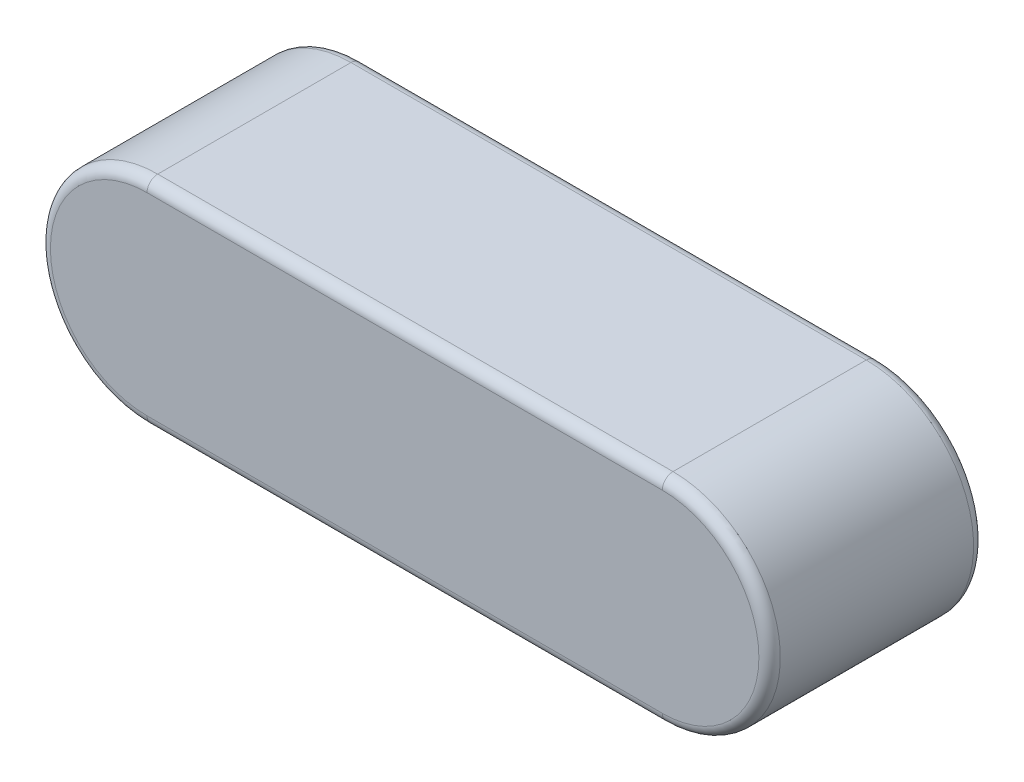
ISO-10303-21;
HEADER;
FILE_DESCRIPTION(('STEP AP214'),'2;1');
FILE_NAME('part.step','',(''),(''),'','','');
FILE_SCHEMA(('AUTOMOTIVE_DESIGN { 1 0 10303 214 1 1 1 1 }'));
ENDSEC;
DATA;
#1=APPLICATION_CONTEXT('core data for automotive mechanical design processes');
#2=APPLICATION_PROTOCOL_DEFINITION('international standard','automotive_design',2000,#1);
#3=PRODUCT_CONTEXT('',#1,'mechanical');
#4=PRODUCT('Part','Part','',(#3));
#5=PRODUCT_RELATED_PRODUCT_CATEGORY('part','',(#4));
#6=PRODUCT_DEFINITION_FORMATION('','',#4);
#7=PRODUCT_DEFINITION_CONTEXT('part definition',#1,'design');
#8=PRODUCT_DEFINITION('design','',#6,#7);
#9=PRODUCT_DEFINITION_SHAPE('','',#8);
#10=(LENGTH_UNIT() NAMED_UNIT(*) SI_UNIT(.MILLI.,.METRE.));
#11=(NAMED_UNIT(*) PLANE_ANGLE_UNIT() SI_UNIT($,.RADIAN.));
#12=(NAMED_UNIT(*) SI_UNIT($,.STERADIAN.) SOLID_ANGLE_UNIT());
#13=UNCERTAINTY_MEASURE_WITH_UNIT(LENGTH_MEASURE(1.E-05),#10,'distance_accuracy_value','');
#14=(GEOMETRIC_REPRESENTATION_CONTEXT(3) GLOBAL_UNCERTAINTY_ASSIGNED_CONTEXT((#13)) GLOBAL_UNIT_ASSIGNED_CONTEXT((#10,
#11,#12)) REPRESENTATION_CONTEXT('',''));
#15=CARTESIAN_POINT('',(0.,0.,0.));
#16=DIRECTION('',(0.,0.,1.));
#17=DIRECTION('',(1.,0.,0.));
#18=AXIS2_PLACEMENT_3D('',#15,#16,#17);
#19=CARTESIAN_POINT('',(-6.,0.,5.));
#20=DIRECTION('',(0.,0.,-1.));
#21=DIRECTION('',(-1.,0.,0.));
#22=AXIS2_PLACEMENT_3D('',#19,#20,#21);
#23=CYLINDRICAL_SURFACE('',#22,2.5);
#24=DIRECTION('',(0.,0.,-1.));
#25=VECTOR('',#24,1.);
#26=CARTESIAN_POINT('',(-6.,-2.5,5.));
#27=LINE('',#26,#25);
#28=CARTESIAN_POINT('',(-6.,-2.5,4.75));
#29=VERTEX_POINT('',#28);
#30=CARTESIAN_POINT('',(-6.,-2.5,0.25));
#31=VERTEX_POINT('',#30);
#32=EDGE_CURVE('E123',#29,#31,#27,.T.);
#33=ORIENTED_EDGE('',*,*,#32,.F.);
#34=CARTESIAN_POINT('',(-6.,0.,4.75));
#35=DIRECTION('',(0.,0.,1.));
#36=DIRECTION('',(1.,0.,0.));
#37=AXIS2_PLACEMENT_3D('',#34,#35,#36);
#38=CIRCLE('',#37,2.5);
#39=CARTESIAN_POINT('',(-6.,2.5,4.75));
#40=VERTEX_POINT('',#39);
#41=EDGE_CURVE('E59',#29,#40,#38,.F.);
#42=ORIENTED_EDGE('',*,*,#41,.T.);
#43=DIRECTION('',(0.,0.,-1.));
#44=VECTOR('',#43,1.);
#45=CARTESIAN_POINT('',(-6.,2.5,5.));
#46=LINE('',#45,#44);
#47=CARTESIAN_POINT('',(-6.,2.5,0.25));
#48=VERTEX_POINT('',#47);
#49=EDGE_CURVE('E159',#40,#48,#46,.T.);
#50=ORIENTED_EDGE('',*,*,#49,.T.);
#51=CARTESIAN_POINT('',(-6.,0.,0.25));
#52=DIRECTION('',(0.,0.,1.));
#53=DIRECTION('',(1.,0.,0.));
#54=AXIS2_PLACEMENT_3D('',#51,#52,#53);
#55=CIRCLE('',#54,2.5);
#56=EDGE_CURVE('E150',#48,#31,#55,.T.);
#57=ORIENTED_EDGE('',*,*,#56,.T.);
#58=EDGE_LOOP('',(#33,#42,#50,#57));
#59=FACE_BOUND('',#58,.T.);
#60=ADVANCED_FACE('F36',(#59),#23,.T.);
#61=CARTESIAN_POINT('',(-6.,-2.5,5.));
#62=DIRECTION('',(0.,1.,0.));
#63=DIRECTION('',(-1.,0.,0.));
#64=AXIS2_PLACEMENT_3D('',#61,#62,#63);
#65=PLANE('',#64);
#66=DIRECTION('',(0.,0.,-1.));
#67=VECTOR('',#66,1.);
#68=CARTESIAN_POINT('',(6.,-2.49999999999999,5.));
#69=LINE('',#68,#67);
#70=CARTESIAN_POINT('',(6.,-2.49999999999999,4.75));
#71=VERTEX_POINT('',#70);
#72=CARTESIAN_POINT('',(6.,-2.49999999999999,0.25));
#73=VERTEX_POINT('',#72);
#74=EDGE_CURVE('E192',#71,#73,#69,.T.);
#75=ORIENTED_EDGE('',*,*,#74,.F.);
#76=DIRECTION('',(1.,0.,0.));
#77=VECTOR('',#76,1.);
#78=CARTESIAN_POINT('',(-6.,-2.5,4.75));
#79=LINE('',#78,#77);
#80=EDGE_CURVE('E148',#71,#29,#79,.F.);
#81=ORIENTED_EDGE('',*,*,#80,.T.);
#82=ORIENTED_EDGE('',*,*,#32,.T.);
#83=DIRECTION('',(1.,0.,0.));
#84=VECTOR('',#83,1.);
#85=CARTESIAN_POINT('',(-6.,-2.5,0.25));
#86=LINE('',#85,#84);
#87=EDGE_CURVE('E146',#31,#73,#86,.T.);
#88=ORIENTED_EDGE('',*,*,#87,.T.);
#89=EDGE_LOOP('',(#75,#81,#82,#88));
#90=FACE_BOUND('',#89,.T.);
#91=ADVANCED_FACE('F206',(#90),#65,.F.);
#92=CARTESIAN_POINT('',(6.,0.,5.));
#93=DIRECTION('',(0.,0.,-1.));
#94=DIRECTION('',(-1.,0.,0.));
#95=AXIS2_PLACEMENT_3D('',#92,#93,#94);
#96=CYLINDRICAL_SURFACE('',#95,2.5);
#97=DIRECTION('',(0.,0.,-1.));
#98=VECTOR('',#97,1.);
#99=CARTESIAN_POINT('',(6.,2.5,5.));
#100=LINE('',#99,#98);
#101=CARTESIAN_POINT('',(6.,2.5,4.75));
#102=VERTEX_POINT('',#101);
#103=CARTESIAN_POINT('',(6.,2.5,0.25));
#104=VERTEX_POINT('',#103);
#105=EDGE_CURVE('E190',#102,#104,#100,.T.);
#106=ORIENTED_EDGE('',*,*,#105,.F.);
#107=CARTESIAN_POINT('',(6.,0.,4.75));
#108=DIRECTION('',(0.,0.,1.));
#109=DIRECTION('',(1.,0.,0.));
#110=AXIS2_PLACEMENT_3D('',#107,#108,#109);
#111=CIRCLE('',#110,2.5);
#112=EDGE_CURVE('E110',#102,#71,#111,.F.);
#113=ORIENTED_EDGE('',*,*,#112,.T.);
#114=ORIENTED_EDGE('',*,*,#74,.T.);
#115=CARTESIAN_POINT('',(6.,0.,0.25));
#116=DIRECTION('',(0.,0.,1.));
#117=DIRECTION('',(1.,0.,0.));
#118=AXIS2_PLACEMENT_3D('',#115,#116,#117);
#119=CIRCLE('',#118,2.5);
#120=EDGE_CURVE('E129',#73,#104,#119,.T.);
#121=ORIENTED_EDGE('',*,*,#120,.T.);
#122=EDGE_LOOP('',(#106,#113,#114,#121));
#123=FACE_BOUND('',#122,.T.);
#124=ADVANCED_FACE('F189',(#123),#96,.T.);
#125=CARTESIAN_POINT('',(-6.,2.5,5.));
#126=DIRECTION('',(0.,-1.,0.));
#127=DIRECTION('',(1.,0.,0.));
#128=AXIS2_PLACEMENT_3D('',#125,#126,#127);
#129=PLANE('',#128);
#130=ORIENTED_EDGE('',*,*,#49,.F.);
#131=DIRECTION('',(-1.,0.,0.));
#132=VECTOR('',#131,1.);
#133=CARTESIAN_POINT('',(6.,2.5,4.75));
#134=LINE('',#133,#132);
#135=EDGE_CURVE('E11',#40,#102,#134,.F.);
#136=ORIENTED_EDGE('',*,*,#135,.T.);
#137=ORIENTED_EDGE('',*,*,#105,.T.);
#138=DIRECTION('',(-1.,0.,0.));
#139=VECTOR('',#138,1.);
#140=CARTESIAN_POINT('',(-6.,2.5,0.25));
#141=LINE('',#140,#139);
#142=EDGE_CURVE('E45',#104,#48,#141,.T.);
#143=ORIENTED_EDGE('',*,*,#142,.T.);
#144=EDGE_LOOP('',(#130,#136,#137,#143));
#145=FACE_BOUND('',#144,.T.);
#146=ADVANCED_FACE('F193',(#145),#129,.F.);
#147=CARTESIAN_POINT('',(-6.,0.,5.));
#148=DIRECTION('',(0.,0.,1.));
#149=DIRECTION('',(1.,0.,0.));
#150=AXIS2_PLACEMENT_3D('',#147,#148,#149);
#151=PLANE('',#150);
#152=DIRECTION('',(1.,0.,0.));
#153=VECTOR('',#152,1.);
#154=CARTESIAN_POINT('',(6.,-2.25,5.));
#155=LINE('',#154,#153);
#156=CARTESIAN_POINT('',(-6.,-2.25,5.));
#157=VERTEX_POINT('',#156);
#158=CARTESIAN_POINT('',(6.,-2.25,5.));
#159=VERTEX_POINT('',#158);
#160=EDGE_CURVE('E127',#157,#159,#155,.T.);
#161=ORIENTED_EDGE('',*,*,#160,.T.);
#162=CARTESIAN_POINT('',(6.,0.,5.));
#163=DIRECTION('',(0.,0.,1.));
#164=DIRECTION('',(1.,0.,0.));
#165=AXIS2_PLACEMENT_3D('',#162,#163,#164);
#166=CIRCLE('',#165,2.25);
#167=CARTESIAN_POINT('',(6.,2.25,5.));
#168=VERTEX_POINT('',#167);
#169=EDGE_CURVE('E108',#159,#168,#166,.T.);
#170=ORIENTED_EDGE('',*,*,#169,.T.);
#171=DIRECTION('',(-1.,0.,0.));
#172=VECTOR('',#171,1.);
#173=CARTESIAN_POINT('',(-6.,2.25,5.));
#174=LINE('',#173,#172);
#175=CARTESIAN_POINT('',(-6.,2.25,5.));
#176=VERTEX_POINT('',#175);
#177=EDGE_CURVE('E116',#168,#176,#174,.T.);
#178=ORIENTED_EDGE('',*,*,#177,.T.);
#179=CARTESIAN_POINT('',(-6.,0.,5.));
#180=DIRECTION('',(0.,0.,1.));
#181=DIRECTION('',(1.,0.,0.));
#182=AXIS2_PLACEMENT_3D('',#179,#180,#181);
#183=CIRCLE('',#182,2.25);
#184=EDGE_CURVE('E122',#176,#157,#183,.T.);
#185=ORIENTED_EDGE('',*,*,#184,.T.);
#186=EDGE_LOOP('',(#161,#170,#178,#185));
#187=FACE_BOUND('',#186,.T.);
#188=ADVANCED_FACE('F125',(#187),#151,.T.);
#189=CARTESIAN_POINT('',(-6.,0.,0.));
#190=DIRECTION('',(0.,0.,1.));
#191=DIRECTION('',(1.,0.,0.));
#192=AXIS2_PLACEMENT_3D('',#189,#190,#191);
#193=PLANE('',#192);
#194=DIRECTION('',(-1.,0.,0.));
#195=VECTOR('',#194,1.);
#196=CARTESIAN_POINT('',(-6.,2.25,0.));
#197=LINE('',#196,#195);
#198=CARTESIAN_POINT('',(-6.,2.25,0.));
#199=VERTEX_POINT('',#198);
#200=CARTESIAN_POINT('',(6.,2.25,0.));
#201=VERTEX_POINT('',#200);
#202=EDGE_CURVE('E141',#199,#201,#197,.F.);
#203=ORIENTED_EDGE('',*,*,#202,.T.);
#204=CARTESIAN_POINT('',(6.,0.,0.));
#205=DIRECTION('',(0.,0.,1.));
#206=DIRECTION('',(1.,0.,0.));
#207=AXIS2_PLACEMENT_3D('',#204,#205,#206);
#208=CIRCLE('',#207,2.25);
#209=CARTESIAN_POINT('',(6.,-2.25,0.));
#210=VERTEX_POINT('',#209);
#211=EDGE_CURVE('E143',#201,#210,#208,.F.);
#212=ORIENTED_EDGE('',*,*,#211,.T.);
#213=DIRECTION('',(1.,0.,0.));
#214=VECTOR('',#213,1.);
#215=CARTESIAN_POINT('',(-6.,-2.25,0.));
#216=LINE('',#215,#214);
#217=CARTESIAN_POINT('',(-6.,-2.25,0.));
#218=VERTEX_POINT('',#217);
#219=EDGE_CURVE('E137',#210,#218,#216,.F.);
#220=ORIENTED_EDGE('',*,*,#219,.T.);
#221=CARTESIAN_POINT('',(-6.,0.,0.));
#222=DIRECTION('',(0.,0.,1.));
#223=DIRECTION('',(1.,0.,0.));
#224=AXIS2_PLACEMENT_3D('',#221,#222,#223);
#225=CIRCLE('',#224,2.25);
#226=EDGE_CURVE('E139',#218,#199,#225,.F.);
#227=ORIENTED_EDGE('',*,*,#226,.T.);
#228=EDGE_LOOP('',(#203,#212,#220,#227));
#229=FACE_BOUND('',#228,.T.);
#230=ADVANCED_FACE('F179',(#229),#193,.F.);
#231=CARTESIAN_POINT('',(-6.,0.,4.75));
#232=DIRECTION('',(0.,0.,1.));
#233=DIRECTION('',(1.,0.,0.));
#234=AXIS2_PLACEMENT_3D('',#231,#232,#233);
#235=TOROIDAL_SURFACE('',#234,2.25,0.25);
#236=CARTESIAN_POINT('',(-6.,2.25,4.75));
#237=DIRECTION('',(1.,0.,0.));
#238=DIRECTION('',(0.,0.,-1.));
#239=AXIS2_PLACEMENT_3D('',#236,#237,#238);
#240=CIRCLE('',#239,0.25);
#241=EDGE_CURVE('E119',#40,#176,#240,.T.);
#242=ORIENTED_EDGE('',*,*,#241,.F.);
#243=ORIENTED_EDGE('',*,*,#41,.F.);
#244=CARTESIAN_POINT('',(-6.,-2.25,4.75));
#245=DIRECTION('',(1.,0.,0.));
#246=DIRECTION('',(0.,0.,-1.));
#247=AXIS2_PLACEMENT_3D('',#244,#245,#246);
#248=CIRCLE('',#247,0.25);
#249=EDGE_CURVE('E156',#157,#29,#248,.T.);
#250=ORIENTED_EDGE('',*,*,#249,.F.);
#251=ORIENTED_EDGE('',*,*,#184,.F.);
#252=EDGE_LOOP('',(#242,#243,#250,#251));
#253=FACE_BOUND('',#252,.T.);
#254=ADVANCED_FACE('F201',(#253),#235,.T.);
#255=CARTESIAN_POINT('',(-6.,-2.25,4.75));
#256=DIRECTION('',(-1.,0.,0.));
#257=DIRECTION('',(0.,-1.,0.));
#258=AXIS2_PLACEMENT_3D('',#255,#256,#257);
#259=CYLINDRICAL_SURFACE('',#258,0.25);
#260=ORIENTED_EDGE('',*,*,#249,.T.);
#261=ORIENTED_EDGE('',*,*,#80,.F.);
#262=CARTESIAN_POINT('',(6.,-2.25,4.75));
#263=DIRECTION('',(1.,0.,0.));
#264=DIRECTION('',(0.,0.,-1.));
#265=AXIS2_PLACEMENT_3D('',#262,#263,#264);
#266=CIRCLE('',#265,0.25);
#267=EDGE_CURVE('E113',#159,#71,#266,.T.);
#268=ORIENTED_EDGE('',*,*,#267,.F.);
#269=ORIENTED_EDGE('',*,*,#160,.F.);
#270=EDGE_LOOP('',(#260,#261,#268,#269));
#271=FACE_BOUND('',#270,.T.);
#272=ADVANCED_FACE('F204',(#271),#259,.T.);
#273=CARTESIAN_POINT('',(-6.,2.25,4.75));
#274=DIRECTION('',(1.,0.,0.));
#275=DIRECTION('',(0.,1.,0.));
#276=AXIS2_PLACEMENT_3D('',#273,#274,#275);
#277=CYLINDRICAL_SURFACE('',#276,0.25);
#278=ORIENTED_EDGE('',*,*,#241,.T.);
#279=ORIENTED_EDGE('',*,*,#177,.F.);
#280=CARTESIAN_POINT('',(6.,2.25,4.75));
#281=DIRECTION('',(1.,0.,0.));
#282=DIRECTION('',(0.,0.,-1.));
#283=AXIS2_PLACEMENT_3D('',#280,#281,#282);
#284=CIRCLE('',#283,0.25);
#285=EDGE_CURVE('E104',#102,#168,#284,.T.);
#286=ORIENTED_EDGE('',*,*,#285,.F.);
#287=ORIENTED_EDGE('',*,*,#135,.F.);
#288=EDGE_LOOP('',(#278,#279,#286,#287));
#289=FACE_BOUND('',#288,.T.);
#290=ADVANCED_FACE('F117',(#289),#277,.T.);
#291=CARTESIAN_POINT('',(6.,0.,4.75));
#292=DIRECTION('',(0.,0.,1.));
#293=DIRECTION('',(1.,0.,0.));
#294=AXIS2_PLACEMENT_3D('',#291,#292,#293);
#295=TOROIDAL_SURFACE('',#294,2.25,0.25);
#296=ORIENTED_EDGE('',*,*,#267,.T.);
#297=ORIENTED_EDGE('',*,*,#112,.F.);
#298=ORIENTED_EDGE('',*,*,#285,.T.);
#299=ORIENTED_EDGE('',*,*,#169,.F.);
#300=EDGE_LOOP('',(#296,#297,#298,#299));
#301=FACE_BOUND('',#300,.T.);
#302=ADVANCED_FACE('F106',(#301),#295,.T.);
#303=CARTESIAN_POINT('',(-6.,0.,0.25));
#304=DIRECTION('',(0.,0.,1.));
#305=DIRECTION('',(1.,0.,0.));
#306=AXIS2_PLACEMENT_3D('',#303,#304,#305);
#307=TOROIDAL_SURFACE('',#306,2.25,0.25);
#308=CARTESIAN_POINT('',(-6.,2.25,0.25));
#309=DIRECTION('',(1.,0.,0.));
#310=DIRECTION('',(0.,0.,-1.));
#311=AXIS2_PLACEMENT_3D('',#308,#309,#310);
#312=CIRCLE('',#311,0.25);
#313=EDGE_CURVE('E163',#199,#48,#312,.T.);
#314=ORIENTED_EDGE('',*,*,#313,.F.);
#315=ORIENTED_EDGE('',*,*,#226,.F.);
#316=CARTESIAN_POINT('',(-6.,-2.25,0.25));
#317=DIRECTION('',(1.,0.,0.));
#318=DIRECTION('',(0.,0.,-1.));
#319=AXIS2_PLACEMENT_3D('',#316,#317,#318);
#320=CIRCLE('',#319,0.25);
#321=EDGE_CURVE('E40',#31,#218,#320,.T.);
#322=ORIENTED_EDGE('',*,*,#321,.F.);
#323=ORIENTED_EDGE('',*,*,#56,.F.);
#324=EDGE_LOOP('',(#314,#315,#322,#323));
#325=FACE_BOUND('',#324,.T.);
#326=ADVANCED_FACE('F38',(#325),#307,.T.);
#327=CARTESIAN_POINT('',(-6.,-2.25,0.25));
#328=DIRECTION('',(1.,0.,0.));
#329=DIRECTION('',(0.,1.,0.));
#330=AXIS2_PLACEMENT_3D('',#327,#328,#329);
#331=CYLINDRICAL_SURFACE('',#330,0.25);
#332=ORIENTED_EDGE('',*,*,#321,.T.);
#333=ORIENTED_EDGE('',*,*,#219,.F.);
#334=CARTESIAN_POINT('',(6.,-2.25,0.25));
#335=DIRECTION('',(1.,0.,0.));
#336=DIRECTION('',(0.,0.,-1.));
#337=AXIS2_PLACEMENT_3D('',#334,#335,#336);
#338=CIRCLE('',#337,0.25);
#339=EDGE_CURVE('E162',#73,#210,#338,.T.);
#340=ORIENTED_EDGE('',*,*,#339,.F.);
#341=ORIENTED_EDGE('',*,*,#87,.F.);
#342=EDGE_LOOP('',(#332,#333,#340,#341));
#343=FACE_BOUND('',#342,.T.);
#344=ADVANCED_FACE('F173',(#343),#331,.T.);
#345=CARTESIAN_POINT('',(-6.,2.25,0.25));
#346=DIRECTION('',(-1.,0.,0.));
#347=DIRECTION('',(0.,-1.,0.));
#348=AXIS2_PLACEMENT_3D('',#345,#346,#347);
#349=CYLINDRICAL_SURFACE('',#348,0.25);
#350=ORIENTED_EDGE('',*,*,#313,.T.);
#351=ORIENTED_EDGE('',*,*,#142,.F.);
#352=CARTESIAN_POINT('',(6.,2.25,0.25));
#353=DIRECTION('',(1.,0.,0.));
#354=DIRECTION('',(0.,0.,-1.));
#355=AXIS2_PLACEMENT_3D('',#352,#353,#354);
#356=CIRCLE('',#355,0.25);
#357=EDGE_CURVE('E160',#201,#104,#356,.T.);
#358=ORIENTED_EDGE('',*,*,#357,.F.);
#359=ORIENTED_EDGE('',*,*,#202,.F.);
#360=EDGE_LOOP('',(#350,#351,#358,#359));
#361=FACE_BOUND('',#360,.T.);
#362=ADVANCED_FACE('F185',(#361),#349,.T.);
#363=CARTESIAN_POINT('',(6.,0.,0.25));
#364=DIRECTION('',(0.,0.,1.));
#365=DIRECTION('',(1.,0.,0.));
#366=AXIS2_PLACEMENT_3D('',#363,#364,#365);
#367=TOROIDAL_SURFACE('',#366,2.25,0.25);
#368=ORIENTED_EDGE('',*,*,#339,.T.);
#369=ORIENTED_EDGE('',*,*,#211,.F.);
#370=ORIENTED_EDGE('',*,*,#357,.T.);
#371=ORIENTED_EDGE('',*,*,#120,.F.);
#372=EDGE_LOOP('',(#368,#369,#370,#371));
#373=FACE_BOUND('',#372,.T.);
#374=ADVANCED_FACE('F183',(#373),#367,.T.);
#375=CLOSED_SHELL('',(#60,#91,#124,#146,#188,#230,#254,#272,#290,#302,#326,#344,#362,#374));
#376=MANIFOLD_SOLID_BREP('B2',#375);
#377=ADVANCED_BREP_SHAPE_REPRESENTATION('',(#18,#376),#14);
#378=SHAPE_DEFINITION_REPRESENTATION(#9,#377);
ENDSEC;
END-ISO-10303-21;
